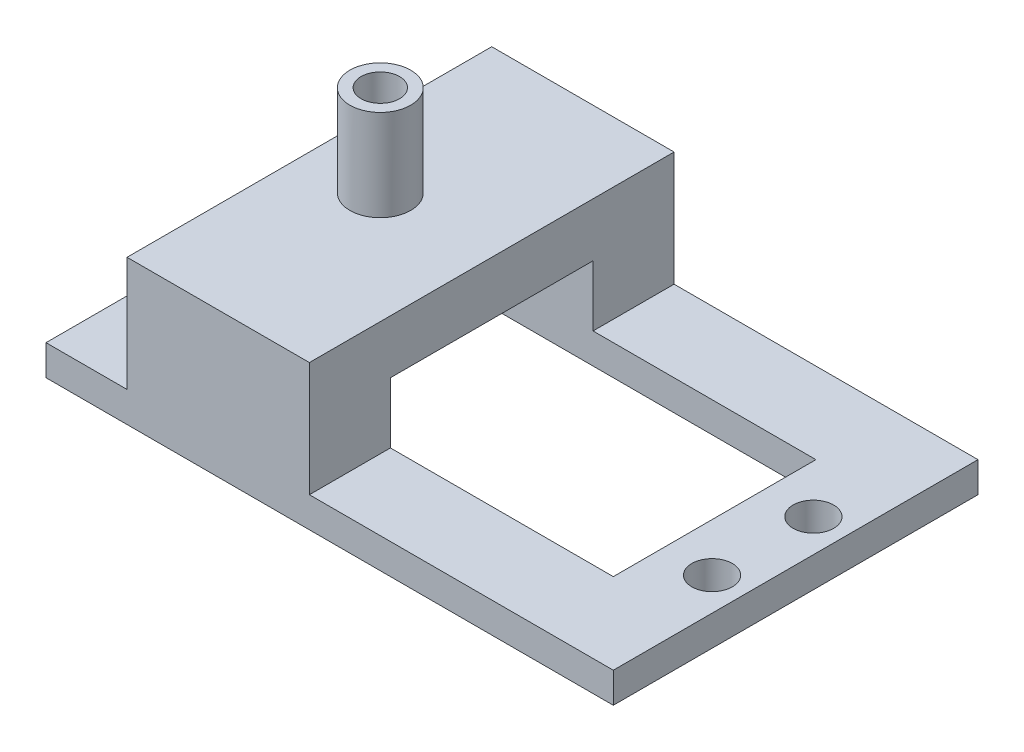
ISO-10303-21;
HEADER;
FILE_DESCRIPTION(('STEP AP214'),'2;1');
FILE_NAME('part.step','',(''),(''),'','','');
FILE_SCHEMA(('AUTOMOTIVE_DESIGN { 1 0 10303 214 1 1 1 1 }'));
ENDSEC;
DATA;
#1=APPLICATION_CONTEXT('core data for automotive mechanical design processes');
#2=APPLICATION_PROTOCOL_DEFINITION('international standard','automotive_design',2000,#1);
#3=PRODUCT_CONTEXT('',#1,'mechanical');
#4=PRODUCT('Part','Part','',(#3));
#5=PRODUCT_RELATED_PRODUCT_CATEGORY('part','',(#4));
#6=PRODUCT_DEFINITION_FORMATION('','',#4);
#7=PRODUCT_DEFINITION_CONTEXT('part definition',#1,'design');
#8=PRODUCT_DEFINITION('design','',#6,#7);
#9=PRODUCT_DEFINITION_SHAPE('','',#8);
#10=(LENGTH_UNIT() NAMED_UNIT(*) SI_UNIT(.MILLI.,.METRE.));
#11=(NAMED_UNIT(*) PLANE_ANGLE_UNIT() SI_UNIT($,.RADIAN.));
#12=(NAMED_UNIT(*) SI_UNIT($,.STERADIAN.) SOLID_ANGLE_UNIT());
#13=UNCERTAINTY_MEASURE_WITH_UNIT(LENGTH_MEASURE(1.E-05),#10,'distance_accuracy_value','');
#14=(GEOMETRIC_REPRESENTATION_CONTEXT(3) GLOBAL_UNCERTAINTY_ASSIGNED_CONTEXT((#13)) GLOBAL_UNIT_ASSIGNED_CONTEXT((#10,
#11,#12)) REPRESENTATION_CONTEXT('',''));
#15=CARTESIAN_POINT('',(0.,0.,0.));
#16=DIRECTION('',(0.,0.,1.));
#17=DIRECTION('',(1.,0.,0.));
#18=AXIS2_PLACEMENT_3D('',#15,#16,#17);
#19=CARTESIAN_POINT('',(-14.0978187475176,11.3,5.43830762610883));
#20=DIRECTION('',(0.,-1.,0.));
#21=DIRECTION('',(0.,0.,-1.));
#22=AXIS2_PLACEMENT_3D('',#19,#20,#21);
#23=CYLINDRICAL_SURFACE('',#22,1.9);
#24=CARTESIAN_POINT('',(-14.0978187475176,20.3,5.43830762610883));
#25=DIRECTION('',(0.,1.,0.));
#26=DIRECTION('',(0.,0.,1.));
#27=AXIS2_PLACEMENT_3D('',#24,#25,#26);
#28=CIRCLE('',#27,1.9);
#29=CARTESIAN_POINT('',(-14.0978187475176,20.3,7.33830762610883));
#30=VERTEX_POINT('',#29);
#31=EDGE_CURVE('E243',#30,#30,#28,.T.);
#32=ORIENTED_EDGE('',*,*,#31,.T.);
#33=EDGE_LOOP('',(#32));
#34=FACE_BOUND('',#33,.T.);
#35=CARTESIAN_POINT('',(-14.0978187475176,9.,5.43830762610883));
#36=DIRECTION('',(0.,-1.,0.));
#37=DIRECTION('',(0.,0.,-1.));
#38=AXIS2_PLACEMENT_3D('',#35,#36,#37);
#39=CIRCLE('',#38,1.9);
#40=CARTESIAN_POINT('',(-14.0978187475176,9.,3.53830762610883));
#41=VERTEX_POINT('',#40);
#42=EDGE_CURVE('E45',#41,#41,#39,.T.);
#43=ORIENTED_EDGE('',*,*,#42,.T.);
#44=EDGE_LOOP('',(#43));
#45=FACE_BOUND('',#44,.T.);
#46=ADVANCED_FACE('F41',(#34,#45),#23,.F.);
#47=CARTESIAN_POINT('',(0.,11.3,0.));
#48=DIRECTION('',(0.,-1.,0.));
#49=DIRECTION('',(0.,0.,-1.));
#50=AXIS2_PLACEMENT_3D('',#47,#48,#49);
#51=PLANE('',#50);
#52=DIRECTION('',(0.,0.,1.));
#53=VECTOR('',#52,1.);
#54=CARTESIAN_POINT('',(-21.0978187475176,11.3,23.4383076261088));
#55=LINE('',#54,#53);
#56=CARTESIAN_POINT('',(-21.0978187475176,11.3,-12.5616923738912));
#57=VERTEX_POINT('',#56);
#58=CARTESIAN_POINT('',(-21.0978187475176,11.3,23.4383076261088));
#59=VERTEX_POINT('',#58);
#60=EDGE_CURVE('E250',#57,#59,#55,.T.);
#61=ORIENTED_EDGE('',*,*,#60,.T.);
#62=DIRECTION('',(1.,0.,0.));
#63=VECTOR('',#62,1.);
#64=CARTESIAN_POINT('',(-21.0978187475176,11.3,23.4383076261088));
#65=LINE('',#64,#63);
#66=CARTESIAN_POINT('',(-3.09781874751758,11.3,23.4383076261088));
#67=VERTEX_POINT('',#66);
#68=EDGE_CURVE('E253',#59,#67,#65,.T.);
#69=ORIENTED_EDGE('',*,*,#68,.T.);
#70=DIRECTION('',(0.,0.,-1.));
#71=VECTOR('',#70,1.);
#72=CARTESIAN_POINT('',(-3.09781874751758,11.3,23.4383076261088));
#73=LINE('',#72,#71);
#74=CARTESIAN_POINT('',(-3.09781874751758,11.3,-12.5616923738912));
#75=VERTEX_POINT('',#74);
#76=EDGE_CURVE('E257',#67,#75,#73,.T.);
#77=ORIENTED_EDGE('',*,*,#76,.T.);
#78=DIRECTION('',(-1.,0.,0.));
#79=VECTOR('',#78,1.);
#80=CARTESIAN_POINT('',(-21.0978187475176,11.3,-12.5616923738912));
#81=LINE('',#80,#79);
#82=EDGE_CURVE('E260',#75,#57,#81,.T.);
#83=ORIENTED_EDGE('',*,*,#82,.T.);
#84=EDGE_LOOP('',(#61,#69,#77,#83));
#85=FACE_BOUND('',#84,.T.);
#86=CARTESIAN_POINT('',(-14.0978187475176,11.3,5.43830762610883));
#87=DIRECTION('',(0.,-1.,0.));
#88=DIRECTION('',(0.,0.,-1.));
#89=AXIS2_PLACEMENT_3D('',#86,#87,#88);
#90=CIRCLE('',#89,3.);
#91=CARTESIAN_POINT('',(-14.0978187475176,11.3,2.43830762610883));
#92=VERTEX_POINT('',#91);
#93=EDGE_CURVE('E11',#92,#92,#90,.F.);
#94=ORIENTED_EDGE('',*,*,#93,.F.);
#95=EDGE_LOOP('',(#94));
#96=FACE_BOUND('',#95,.T.);
#97=ADVANCED_FACE('F423',(#85,#96),#51,.F.);
#98=CARTESIAN_POINT('',(0.,0.,0.));
#99=DIRECTION('',(0.,1.,0.));
#100=DIRECTION('',(0.,0.,1.));
#101=AXIS2_PLACEMENT_3D('',#98,#99,#100);
#102=PLANE('',#101);
#103=CARTESIAN_POINT('',(-25.8478187475176,0.,0.438307626108829));
#104=DIRECTION('',(0.,1.,0.));
#105=DIRECTION('',(0.,0.,1.));
#106=AXIS2_PLACEMENT_3D('',#103,#104,#105);
#107=CIRCLE('',#106,2.);
#108=CARTESIAN_POINT('',(-25.8478187475176,0.,2.43830762610883));
#109=VERTEX_POINT('',#108);
#110=EDGE_CURVE('E631',#109,#109,#107,.T.);
#111=ORIENTED_EDGE('',*,*,#110,.F.);
#112=EDGE_LOOP('',(#111));
#113=FACE_BOUND('',#112,.T.);
#114=CARTESIAN_POINT('',(-25.8478187475176,0.,10.4383076261088));
#115=DIRECTION('',(0.,1.,0.));
#116=DIRECTION('',(0.,0.,1.));
#117=AXIS2_PLACEMENT_3D('',#114,#115,#116);
#118=CIRCLE('',#117,2.);
#119=CARTESIAN_POINT('',(-25.8478187475176,0.,12.4383076261088));
#120=VERTEX_POINT('',#119);
#121=EDGE_CURVE('E641',#120,#120,#118,.T.);
#122=ORIENTED_EDGE('',*,*,#121,.F.);
#123=EDGE_LOOP('',(#122));
#124=FACE_BOUND('',#123,.T.);
#125=DIRECTION('',(0.,0.,1.));
#126=VECTOR('',#125,1.);
#127=CARTESIAN_POINT('',(-21.0978187475176,0.,-4.56169237389117));
#128=LINE('',#127,#126);
#129=CARTESIAN_POINT('',(-21.0978187475176,0.,-12.5616923738912));
#130=VERTEX_POINT('',#129);
#131=CARTESIAN_POINT('',(-21.0978187475176,0.,-4.56169237389117));
#132=VERTEX_POINT('',#131);
#133=EDGE_CURVE('E272',#130,#132,#128,.T.);
#134=ORIENTED_EDGE('',*,*,#133,.F.);
#135=DIRECTION('',(1.,0.,0.));
#136=VECTOR('',#135,1.);
#137=CARTESIAN_POINT('',(0.,0.,-12.5616923738912));
#138=LINE('',#137,#136);
#139=CARTESIAN_POINT('',(-29.0978187475176,0.,-12.5616923738912));
#140=VERTEX_POINT('',#139);
#141=EDGE_CURVE('E336',#140,#130,#138,.T.);
#142=ORIENTED_EDGE('',*,*,#141,.F.);
#143=DIRECTION('',(0.,0.,-1.));
#144=VECTOR('',#143,1.);
#145=CARTESIAN_POINT('',(-29.0978187475176,0.,0.));
#146=LINE('',#145,#144);
#147=CARTESIAN_POINT('',(-29.0978187475176,0.,23.4383076261088));
#148=VERTEX_POINT('',#147);
#149=EDGE_CURVE('E339',#148,#140,#146,.T.);
#150=ORIENTED_EDGE('',*,*,#149,.F.);
#151=DIRECTION('',(1.,0.,0.));
#152=VECTOR('',#151,1.);
#153=CARTESIAN_POINT('',(-29.0978187475176,0.,23.4383076261088));
#154=LINE('',#153,#152);
#155=CARTESIAN_POINT('',(-21.0978187475176,0.,23.4383076261088));
#156=VERTEX_POINT('',#155);
#157=EDGE_CURVE('E366',#148,#156,#154,.T.);
#158=ORIENTED_EDGE('',*,*,#157,.T.);
#159=DIRECTION('',(0.,0.,1.));
#160=VECTOR('',#159,1.);
#161=CARTESIAN_POINT('',(-21.0978187475176,0.,15.4383076261088));
#162=LINE('',#161,#160);
#163=CARTESIAN_POINT('',(-21.0978187475176,0.,15.4383076261088));
#164=VERTEX_POINT('',#163);
#165=EDGE_CURVE('E275',#164,#156,#162,.T.);
#166=ORIENTED_EDGE('',*,*,#165,.F.);
#167=DIRECTION('',(0.,0.,1.));
#168=VECTOR('',#167,1.);
#169=CARTESIAN_POINT('',(-21.0978187475176,0.,0.));
#170=LINE('',#169,#168);
#171=EDGE_CURVE('E312',#132,#164,#170,.T.);
#172=ORIENTED_EDGE('',*,*,#171,.F.);
#173=EDGE_LOOP('',(#134,#142,#150,#158,#166,#172));
#174=FACE_BOUND('',#173,.T.);
#175=ADVANCED_FACE('F413',(#113,#124,#174),#102,.T.);
#176=CARTESIAN_POINT('',(-21.0978187475176,-3.,0.));
#177=DIRECTION('',(-1.,0.,0.));
#178=DIRECTION('',(0.,0.,1.));
#179=AXIS2_PLACEMENT_3D('',#176,#177,#178);
#180=PLANE('',#179);
#181=ORIENTED_EDGE('',*,*,#171,.T.);
#182=DIRECTION('',(0.,1.,0.));
#183=VECTOR('',#182,1.);
#184=CARTESIAN_POINT('',(-21.0978187475176,-3.,15.4383076261088));
#185=LINE('',#184,#183);
#186=CARTESIAN_POINT('',(-21.0978187475176,-3.,15.4383076261088));
#187=VERTEX_POINT('',#186);
#188=EDGE_CURVE('E344',#187,#164,#185,.T.);
#189=ORIENTED_EDGE('',*,*,#188,.F.);
#190=DIRECTION('',(0.,0.,1.));
#191=VECTOR('',#190,1.);
#192=CARTESIAN_POINT('',(-21.0978187475176,-3.,0.));
#193=LINE('',#192,#191);
#194=CARTESIAN_POINT('',(-21.0978187475176,-3.,-4.56169237389117));
#195=VERTEX_POINT('',#194);
#196=EDGE_CURVE('E322',#195,#187,#193,.T.);
#197=ORIENTED_EDGE('',*,*,#196,.F.);
#198=DIRECTION('',(0.,1.,0.));
#199=VECTOR('',#198,1.);
#200=CARTESIAN_POINT('',(-21.0978187475176,-3.,-4.56169237389117));
#201=LINE('',#200,#199);
#202=EDGE_CURVE('E50',#195,#132,#201,.T.);
#203=ORIENTED_EDGE('',*,*,#202,.T.);
#204=EDGE_LOOP('',(#181,#189,#197,#203));
#205=FACE_BOUND('',#204,.T.);
#206=ADVANCED_FACE('F406',(#205),#180,.F.);
#207=CARTESIAN_POINT('',(-29.0978187475176,-3.,0.));
#208=DIRECTION('',(1.,0.,0.));
#209=DIRECTION('',(0.,0.,-1.));
#210=AXIS2_PLACEMENT_3D('',#207,#208,#209);
#211=PLANE('',#210);
#212=ORIENTED_EDGE('',*,*,#149,.T.);
#213=DIRECTION('',(0.,1.,0.));
#214=VECTOR('',#213,1.);
#215=CARTESIAN_POINT('',(-29.0978187475176,-3.,-12.5616923738912));
#216=LINE('',#215,#214);
#217=CARTESIAN_POINT('',(-29.0978187475176,-3.,-12.5616923738912));
#218=VERTEX_POINT('',#217);
#219=EDGE_CURVE('E347',#218,#140,#216,.T.);
#220=ORIENTED_EDGE('',*,*,#219,.F.);
#221=DIRECTION('',(0.,0.,-1.));
#222=VECTOR('',#221,1.);
#223=CARTESIAN_POINT('',(-29.0978187475176,-3.,0.));
#224=LINE('',#223,#222);
#225=CARTESIAN_POINT('',(-29.0978187475176,-3.,23.4383076261088));
#226=VERTEX_POINT('',#225);
#227=EDGE_CURVE('E320',#226,#218,#224,.T.);
#228=ORIENTED_EDGE('',*,*,#227,.F.);
#229=DIRECTION('',(0.,1.,0.));
#230=VECTOR('',#229,1.);
#231=CARTESIAN_POINT('',(-29.0978187475176,-3.,23.4383076261088));
#232=LINE('',#231,#230);
#233=EDGE_CURVE('E329',#226,#148,#232,.T.);
#234=ORIENTED_EDGE('',*,*,#233,.T.);
#235=EDGE_LOOP('',(#212,#220,#228,#234));
#236=FACE_BOUND('',#235,.T.);
#237=ADVANCED_FACE('F420',(#236),#211,.F.);
#238=CARTESIAN_POINT('',(0.,-3.,-12.5616923738912));
#239=DIRECTION('',(0.,0.,1.));
#240=DIRECTION('',(1.,0.,0.));
#241=AXIS2_PLACEMENT_3D('',#238,#239,#240);
#242=PLANE('',#241);
#243=ORIENTED_EDGE('',*,*,#141,.T.);
#244=DIRECTION('',(0.,-1.,0.));
#245=VECTOR('',#244,1.);
#246=CARTESIAN_POINT('',(-21.0978187475176,6.,-12.5616923738912));
#247=LINE('',#246,#245);
#248=EDGE_CURVE('E271',#57,#130,#247,.T.);
#249=ORIENTED_EDGE('',*,*,#248,.F.);
#250=ORIENTED_EDGE('',*,*,#82,.F.);
#251=DIRECTION('',(0.,-1.,0.));
#252=VECTOR('',#251,1.);
#253=CARTESIAN_POINT('',(-3.09781874751758,6.,-12.5616923738912));
#254=LINE('',#253,#252);
#255=CARTESIAN_POINT('',(-3.09781874751758,0.,-12.5616923738912));
#256=VERTEX_POINT('',#255);
#257=EDGE_CURVE('E279',#75,#256,#254,.T.);
#258=ORIENTED_EDGE('',*,*,#257,.T.);
#259=CARTESIAN_POINT('',(26.9021812524824,0.,-12.5616923738912));
#260=VERTEX_POINT('',#259);
#261=EDGE_CURVE('E335',#256,#260,#138,.T.);
#262=ORIENTED_EDGE('',*,*,#261,.T.);
#263=DIRECTION('',(0.,1.,0.));
#264=VECTOR('',#263,1.);
#265=CARTESIAN_POINT('',(26.9021812524824,-3.,-12.5616923738912));
#266=LINE('',#265,#264);
#267=CARTESIAN_POINT('',(26.9021812524824,-3.,-12.5616923738912));
#268=VERTEX_POINT('',#267);
#269=EDGE_CURVE('E350',#268,#260,#266,.T.);
#270=ORIENTED_EDGE('',*,*,#269,.F.);
#271=DIRECTION('',(1.,0.,0.));
#272=VECTOR('',#271,1.);
#273=CARTESIAN_POINT('',(0.,-3.,-12.5616923738912));
#274=LINE('',#273,#272);
#275=EDGE_CURVE('E318',#218,#268,#274,.T.);
#276=ORIENTED_EDGE('',*,*,#275,.F.);
#277=ORIENTED_EDGE('',*,*,#219,.T.);
#278=EDGE_LOOP('',(#243,#249,#250,#258,#262,#270,#276,#277));
#279=FACE_BOUND('',#278,.T.);
#280=ADVANCED_FACE('F415',(#279),#242,.F.);
#281=CARTESIAN_POINT('',(26.9021812524824,-3.,0.));
#282=DIRECTION('',(1.,0.,0.));
#283=DIRECTION('',(0.,0.,-1.));
#284=AXIS2_PLACEMENT_3D('',#281,#282,#283);
#285=PLANE('',#284);
#286=DIRECTION('',(0.,0.,-1.));
#287=VECTOR('',#286,1.);
#288=CARTESIAN_POINT('',(26.9021812524824,0.,0.));
#289=LINE('',#288,#287);
#290=CARTESIAN_POINT('',(26.9021812524824,0.,23.4383076261088));
#291=VERTEX_POINT('',#290);
#292=EDGE_CURVE('E332',#291,#260,#289,.T.);
#293=ORIENTED_EDGE('',*,*,#292,.F.);
#294=DIRECTION('',(0.,1.,0.));
#295=VECTOR('',#294,1.);
#296=CARTESIAN_POINT('',(26.9021812524824,-3.,23.4383076261088));
#297=LINE('',#296,#295);
#298=CARTESIAN_POINT('',(26.9021812524824,-3.,23.4383076261088));
#299=VERTEX_POINT('',#298);
#300=EDGE_CURVE('E365',#299,#291,#297,.T.);
#301=ORIENTED_EDGE('',*,*,#300,.F.);
#302=DIRECTION('',(0.,0.,-1.));
#303=VECTOR('',#302,1.);
#304=CARTESIAN_POINT('',(26.9021812524824,-3.,0.));
#305=LINE('',#304,#303);
#306=EDGE_CURVE('E315',#299,#268,#305,.T.);
#307=ORIENTED_EDGE('',*,*,#306,.T.);
#308=ORIENTED_EDGE('',*,*,#269,.T.);
#309=EDGE_LOOP('',(#293,#301,#307,#308));
#310=FACE_BOUND('',#309,.T.);
#311=ADVANCED_FACE('F380',(#310),#285,.T.);
#312=CARTESIAN_POINT('',(18.9021812524824,-3.,0.));
#313=DIRECTION('',(-1.,0.,0.));
#314=DIRECTION('',(0.,0.,1.));
#315=AXIS2_PLACEMENT_3D('',#312,#313,#314);
#316=PLANE('',#315);
#317=DIRECTION('',(0.,0.,1.));
#318=VECTOR('',#317,1.);
#319=CARTESIAN_POINT('',(18.9021812524824,0.,0.));
#320=LINE('',#319,#318);
#321=CARTESIAN_POINT('',(18.9021812524824,0.,-4.56169237389117));
#322=VERTEX_POINT('',#321);
#323=CARTESIAN_POINT('',(18.9021812524824,0.,15.4383076261088));
#324=VERTEX_POINT('',#323);
#325=EDGE_CURVE('E328',#322,#324,#320,.T.);
#326=ORIENTED_EDGE('',*,*,#325,.F.);
#327=DIRECTION('',(0.,1.,0.));
#328=VECTOR('',#327,1.);
#329=CARTESIAN_POINT('',(18.9021812524824,-3.,-4.56169237389117));
#330=LINE('',#329,#328);
#331=CARTESIAN_POINT('',(18.9021812524824,-3.,-4.56169237389117));
#332=VERTEX_POINT('',#331);
#333=EDGE_CURVE('E325',#332,#322,#330,.T.);
#334=ORIENTED_EDGE('',*,*,#333,.F.);
#335=DIRECTION('',(0.,0.,1.));
#336=VECTOR('',#335,1.);
#337=CARTESIAN_POINT('',(18.9021812524824,-3.,0.));
#338=LINE('',#337,#336);
#339=CARTESIAN_POINT('',(18.9021812524824,-3.,15.4383076261088));
#340=VERTEX_POINT('',#339);
#341=EDGE_CURVE('E311',#332,#340,#338,.T.);
#342=ORIENTED_EDGE('',*,*,#341,.T.);
#343=DIRECTION('',(0.,1.,0.));
#344=VECTOR('',#343,1.);
#345=CARTESIAN_POINT('',(18.9021812524824,-3.,15.4383076261088));
#346=LINE('',#345,#344);
#347=EDGE_CURVE('E353',#340,#324,#346,.T.);
#348=ORIENTED_EDGE('',*,*,#347,.T.);
#349=EDGE_LOOP('',(#326,#334,#342,#348));
#350=FACE_BOUND('',#349,.T.);
#351=ADVANCED_FACE('F399',(#350),#316,.T.);
#352=CARTESIAN_POINT('',(0.,-3.,-4.56169237389117));
#353=DIRECTION('',(0.,0.,1.));
#354=DIRECTION('',(1.,0.,0.));
#355=AXIS2_PLACEMENT_3D('',#352,#353,#354);
#356=PLANE('',#355);
#357=DIRECTION('',(1.,0.,0.));
#358=VECTOR('',#357,1.);
#359=CARTESIAN_POINT('',(0.,0.,-4.56169237389117));
#360=LINE('',#359,#358);
#361=CARTESIAN_POINT('',(-3.09781874751758,0.,-4.56169237389117));
#362=VERTEX_POINT('',#361);
#363=EDGE_CURVE('E326',#362,#322,#360,.T.);
#364=ORIENTED_EDGE('',*,*,#363,.F.);
#365=DIRECTION('',(0.,-1.,0.));
#366=VECTOR('',#365,1.);
#367=CARTESIAN_POINT('',(-3.09781874751758,6.,-4.56169237389117));
#368=LINE('',#367,#366);
#369=CARTESIAN_POINT('',(-3.09781874751758,6.,-4.56169237389117));
#370=VERTEX_POINT('',#369);
#371=EDGE_CURVE('E282',#370,#362,#368,.T.);
#372=ORIENTED_EDGE('',*,*,#371,.F.);
#373=DIRECTION('',(1.,0.,0.));
#374=VECTOR('',#373,1.);
#375=CARTESIAN_POINT('',(-21.0978187475176,6.,-4.56169237389117));
#376=LINE('',#375,#374);
#377=CARTESIAN_POINT('',(-21.0978187475176,6.,-4.56169237389117));
#378=VERTEX_POINT('',#377);
#379=EDGE_CURVE('E268',#378,#370,#376,.T.);
#380=ORIENTED_EDGE('',*,*,#379,.F.);
#381=DIRECTION('',(0.,-1.,0.));
#382=VECTOR('',#381,1.);
#383=CARTESIAN_POINT('',(-21.0978187475176,6.,-4.56169237389117));
#384=LINE('',#383,#382);
#385=EDGE_CURVE('E285',#378,#132,#384,.T.);
#386=ORIENTED_EDGE('',*,*,#385,.T.);
#387=ORIENTED_EDGE('',*,*,#202,.F.);
#388=DIRECTION('',(1.,0.,0.));
#389=VECTOR('',#388,1.);
#390=CARTESIAN_POINT('',(0.,-3.,-4.56169237389117));
#391=LINE('',#390,#389);
#392=EDGE_CURVE('E308',#195,#332,#391,.T.);
#393=ORIENTED_EDGE('',*,*,#392,.T.);
#394=ORIENTED_EDGE('',*,*,#333,.T.);
#395=EDGE_LOOP('',(#364,#372,#380,#386,#387,#393,#394));
#396=FACE_BOUND('',#395,.T.);
#397=ADVANCED_FACE('F395',(#396),#356,.T.);
#398=CARTESIAN_POINT('',(23.6521812524824,0.,10.4383076261088));
#399=DIRECTION('',(0.,1.,0.));
#400=DIRECTION('',(0.,0.,1.));
#401=AXIS2_PLACEMENT_3D('',#398,#399,#400);
#402=CIRCLE('',#401,2.);
#403=CARTESIAN_POINT('',(23.6521812524824,0.,12.4383076261088));
#404=VERTEX_POINT('',#403);
#405=EDGE_CURVE('E628',#404,#404,#402,.T.);
#406=ORIENTED_EDGE('',*,*,#405,.F.);
#407=EDGE_LOOP('',(#406));
#408=FACE_BOUND('',#407,.T.);
#409=CARTESIAN_POINT('',(23.6521812524824,0.,0.438307626108829));
#410=DIRECTION('',(0.,1.,0.));
#411=DIRECTION('',(0.,0.,1.));
#412=AXIS2_PLACEMENT_3D('',#409,#410,#411);
#413=CIRCLE('',#412,2.);
#414=CARTESIAN_POINT('',(23.6521812524824,0.,2.43830762610883));
#415=VERTEX_POINT('',#414);
#416=EDGE_CURVE('E212',#415,#415,#413,.T.);
#417=ORIENTED_EDGE('',*,*,#416,.F.);
#418=EDGE_LOOP('',(#417));
#419=FACE_BOUND('',#418,.T.);
#420=DIRECTION('',(0.,0.,-1.));
#421=VECTOR('',#420,1.);
#422=CARTESIAN_POINT('',(-3.09781874751758,0.,-4.56169237389117));
#423=LINE('',#422,#421);
#424=EDGE_CURVE('E65',#362,#256,#423,.T.);
#425=ORIENTED_EDGE('',*,*,#424,.F.);
#426=ORIENTED_EDGE('',*,*,#363,.T.);
#427=ORIENTED_EDGE('',*,*,#325,.T.);
#428=DIRECTION('',(1.,0.,0.));
#429=VECTOR('',#428,1.);
#430=CARTESIAN_POINT('',(-29.0978187475176,0.,15.4383076261088));
#431=LINE('',#430,#429);
#432=CARTESIAN_POINT('',(-3.09781874751757,0.,15.4383076261088));
#433=VERTEX_POINT('',#432);
#434=EDGE_CURVE('E362',#433,#324,#431,.T.);
#435=ORIENTED_EDGE('',*,*,#434,.F.);
#436=DIRECTION('',(0.,0.,-1.));
#437=VECTOR('',#436,1.);
#438=CARTESIAN_POINT('',(-3.09781874751757,0.,15.4383076261088));
#439=LINE('',#438,#437);
#440=CARTESIAN_POINT('',(-3.09781874751757,0.,23.4383076261088));
#441=VERTEX_POINT('',#440);
#442=EDGE_CURVE('E301',#441,#433,#439,.T.);
#443=ORIENTED_EDGE('',*,*,#442,.F.);
#444=EDGE_CURVE('E288',#441,#291,#154,.T.);
#445=ORIENTED_EDGE('',*,*,#444,.T.);
#446=ORIENTED_EDGE('',*,*,#292,.T.);
#447=ORIENTED_EDGE('',*,*,#261,.F.);
#448=EDGE_LOOP('',(#425,#426,#427,#435,#443,#445,#446,#447));
#449=FACE_BOUND('',#448,.T.);
#450=ADVANCED_FACE('F382',(#408,#419,#449),#102,.T.);
#451=CARTESIAN_POINT('',(0.,-3.,0.));
#452=DIRECTION('',(0.,1.,0.));
#453=DIRECTION('',(0.,0.,1.));
#454=AXIS2_PLACEMENT_3D('',#451,#452,#453);
#455=PLANE('',#454);
#456=CARTESIAN_POINT('',(23.6521812524824,-3.,10.4383076261088));
#457=DIRECTION('',(0.,1.,0.));
#458=DIRECTION('',(0.,0.,1.));
#459=AXIS2_PLACEMENT_3D('',#456,#457,#458);
#460=CIRCLE('',#459,2.);
#461=CARTESIAN_POINT('',(23.6521812524824,-3.,12.4383076261088));
#462=VERTEX_POINT('',#461);
#463=EDGE_CURVE('E625',#462,#462,#460,.T.);
#464=ORIENTED_EDGE('',*,*,#463,.T.);
#465=EDGE_LOOP('',(#464));
#466=FACE_BOUND('',#465,.T.);
#467=CARTESIAN_POINT('',(-25.8478187475176,-3.,0.438307626108829));
#468=DIRECTION('',(0.,1.,0.));
#469=DIRECTION('',(0.,0.,1.));
#470=AXIS2_PLACEMENT_3D('',#467,#468,#469);
#471=CIRCLE('',#470,2.);
#472=CARTESIAN_POINT('',(-25.8478187475176,-3.,2.43830762610883));
#473=VERTEX_POINT('',#472);
#474=EDGE_CURVE('E639',#473,#473,#471,.T.);
#475=ORIENTED_EDGE('',*,*,#474,.T.);
#476=EDGE_LOOP('',(#475));
#477=FACE_BOUND('',#476,.T.);
#478=CARTESIAN_POINT('',(-25.8478187475176,-3.,10.4383076261088));
#479=DIRECTION('',(0.,1.,0.));
#480=DIRECTION('',(0.,0.,1.));
#481=AXIS2_PLACEMENT_3D('',#478,#479,#480);
#482=CIRCLE('',#481,2.);
#483=CARTESIAN_POINT('',(-25.8478187475176,-3.,12.4383076261088));
#484=VERTEX_POINT('',#483);
#485=EDGE_CURVE('E634',#484,#484,#482,.T.);
#486=ORIENTED_EDGE('',*,*,#485,.T.);
#487=EDGE_LOOP('',(#486));
#488=FACE_BOUND('',#487,.T.);
#489=CARTESIAN_POINT('',(23.6521812524824,-3.,0.438307626108829));
#490=DIRECTION('',(0.,1.,0.));
#491=DIRECTION('',(0.,0.,1.));
#492=AXIS2_PLACEMENT_3D('',#489,#490,#491);
#493=CIRCLE('',#492,2.);
#494=CARTESIAN_POINT('',(23.6521812524824,-3.,2.43830762610883));
#495=VERTEX_POINT('',#494);
#496=EDGE_CURVE('E224',#495,#495,#493,.T.);
#497=ORIENTED_EDGE('',*,*,#496,.T.);
#498=EDGE_LOOP('',(#497));
#499=FACE_BOUND('',#498,.T.);
#500=ORIENTED_EDGE('',*,*,#306,.F.);
#501=DIRECTION('',(1.,0.,0.));
#502=VECTOR('',#501,1.);
#503=CARTESIAN_POINT('',(-29.0978187475176,-3.,23.4383076261088));
#504=LINE('',#503,#502);
#505=EDGE_CURVE('E358',#226,#299,#504,.T.);
#506=ORIENTED_EDGE('',*,*,#505,.F.);
#507=ORIENTED_EDGE('',*,*,#227,.T.);
#508=ORIENTED_EDGE('',*,*,#275,.T.);
#509=EDGE_LOOP('',(#500,#506,#507,#508));
#510=FACE_BOUND('',#509,.T.);
#511=ORIENTED_EDGE('',*,*,#392,.F.);
#512=ORIENTED_EDGE('',*,*,#196,.T.);
#513=DIRECTION('',(1.,0.,0.));
#514=VECTOR('',#513,1.);
#515=CARTESIAN_POINT('',(-29.0978187475176,-3.,15.4383076261088));
#516=LINE('',#515,#514);
#517=EDGE_CURVE('E361',#187,#340,#516,.T.);
#518=ORIENTED_EDGE('',*,*,#517,.T.);
#519=ORIENTED_EDGE('',*,*,#341,.F.);
#520=EDGE_LOOP('',(#511,#512,#518,#519));
#521=FACE_BOUND('',#520,.T.);
#522=ADVANCED_FACE('F403',(#466,#477,#488,#499,#510,#521),#455,.F.);
#523=CARTESIAN_POINT('',(-29.0978187475176,-3.,15.4383076261088));
#524=DIRECTION('',(0.,0.,1.));
#525=DIRECTION('',(1.,0.,0.));
#526=AXIS2_PLACEMENT_3D('',#523,#524,#525);
#527=PLANE('',#526);
#528=ORIENTED_EDGE('',*,*,#517,.F.);
#529=ORIENTED_EDGE('',*,*,#188,.T.);
#530=DIRECTION('',(0.,-1.,0.));
#531=VECTOR('',#530,1.);
#532=CARTESIAN_POINT('',(-21.0978187475176,6.,15.4383076261088));
#533=LINE('',#532,#531);
#534=CARTESIAN_POINT('',(-21.0978187475176,6.,15.4383076261088));
#535=VERTEX_POINT('',#534);
#536=EDGE_CURVE('E297',#535,#164,#533,.T.);
#537=ORIENTED_EDGE('',*,*,#536,.F.);
#538=DIRECTION('',(-1.,0.,0.));
#539=VECTOR('',#538,1.);
#540=CARTESIAN_POINT('',(-21.0978187475176,6.,15.4383076261088));
#541=LINE('',#540,#539);
#542=CARTESIAN_POINT('',(-3.09781874751757,6.,15.4383076261088));
#543=VERTEX_POINT('',#542);
#544=EDGE_CURVE('E300',#543,#535,#541,.T.);
#545=ORIENTED_EDGE('',*,*,#544,.F.);
#546=DIRECTION('',(0.,-1.,0.));
#547=VECTOR('',#546,1.);
#548=CARTESIAN_POINT('',(-3.09781874751757,6.,15.4383076261088));
#549=LINE('',#548,#547);
#550=EDGE_CURVE('E294',#543,#433,#549,.T.);
#551=ORIENTED_EDGE('',*,*,#550,.T.);
#552=ORIENTED_EDGE('',*,*,#434,.T.);
#553=ORIENTED_EDGE('',*,*,#347,.F.);
#554=EDGE_LOOP('',(#528,#529,#537,#545,#551,#552,#553));
#555=FACE_BOUND('',#554,.T.);
#556=ADVANCED_FACE('F389',(#555),#527,.F.);
#557=CARTESIAN_POINT('',(-29.0978187475176,-3.,23.4383076261088));
#558=DIRECTION('',(0.,0.,1.));
#559=DIRECTION('',(1.,0.,0.));
#560=AXIS2_PLACEMENT_3D('',#557,#558,#559);
#561=PLANE('',#560);
#562=ORIENTED_EDGE('',*,*,#157,.F.);
#563=ORIENTED_EDGE('',*,*,#233,.F.);
#564=ORIENTED_EDGE('',*,*,#505,.T.);
#565=ORIENTED_EDGE('',*,*,#300,.T.);
#566=ORIENTED_EDGE('',*,*,#444,.F.);
#567=DIRECTION('',(0.,-1.,0.));
#568=VECTOR('',#567,1.);
#569=CARTESIAN_POINT('',(-3.09781874751757,6.,23.4383076261088));
#570=LINE('',#569,#568);
#571=EDGE_CURVE('E291',#67,#441,#570,.T.);
#572=ORIENTED_EDGE('',*,*,#571,.F.);
#573=ORIENTED_EDGE('',*,*,#68,.F.);
#574=DIRECTION('',(0.,-1.,0.));
#575=VECTOR('',#574,1.);
#576=CARTESIAN_POINT('',(-21.0978187475176,6.,23.4383076261088));
#577=LINE('',#576,#575);
#578=EDGE_CURVE('E263',#59,#156,#577,.T.);
#579=ORIENTED_EDGE('',*,*,#578,.T.);
#580=EDGE_LOOP('',(#562,#563,#564,#565,#566,#572,#573,#579));
#581=FACE_BOUND('',#580,.T.);
#582=ADVANCED_FACE('F43',(#581),#561,.T.);
#583=CARTESIAN_POINT('',(-21.0978187475176,6.,-4.56169237389117));
#584=DIRECTION('',(1.,0.,0.));
#585=DIRECTION('',(0.,0.,-1.));
#586=AXIS2_PLACEMENT_3D('',#583,#584,#585);
#587=PLANE('',#586);
#588=ORIENTED_EDGE('',*,*,#133,.T.);
#589=ORIENTED_EDGE('',*,*,#385,.F.);
#590=DIRECTION('',(0.,0.,1.));
#591=VECTOR('',#590,1.);
#592=CARTESIAN_POINT('',(-21.0978187475176,6.,23.4383076261088));
#593=LINE('',#592,#591);
#594=EDGE_CURVE('E249',#378,#535,#593,.T.);
#595=ORIENTED_EDGE('',*,*,#594,.T.);
#596=ORIENTED_EDGE('',*,*,#536,.T.);
#597=ORIENTED_EDGE('',*,*,#165,.T.);
#598=ORIENTED_EDGE('',*,*,#578,.F.);
#599=ORIENTED_EDGE('',*,*,#60,.F.);
#600=ORIENTED_EDGE('',*,*,#248,.T.);
#601=EDGE_LOOP('',(#588,#589,#595,#596,#597,#598,#599,#600));
#602=FACE_BOUND('',#601,.T.);
#603=ADVANCED_FACE('F410',(#602),#587,.F.);
#604=CARTESIAN_POINT('',(-3.09781874751758,6.,-4.56169237389117));
#605=DIRECTION('',(-1.,0.,0.));
#606=DIRECTION('',(0.,0.,1.));
#607=AXIS2_PLACEMENT_3D('',#604,#605,#606);
#608=PLANE('',#607);
#609=ORIENTED_EDGE('',*,*,#424,.T.);
#610=ORIENTED_EDGE('',*,*,#257,.F.);
#611=ORIENTED_EDGE('',*,*,#76,.F.);
#612=ORIENTED_EDGE('',*,*,#571,.T.);
#613=ORIENTED_EDGE('',*,*,#442,.T.);
#614=ORIENTED_EDGE('',*,*,#550,.F.);
#615=DIRECTION('',(0.,0.,-1.));
#616=VECTOR('',#615,1.);
#617=CARTESIAN_POINT('',(-3.09781874751758,6.,23.4383076261088));
#618=LINE('',#617,#616);
#619=EDGE_CURVE('E254',#543,#370,#618,.T.);
#620=ORIENTED_EDGE('',*,*,#619,.T.);
#621=ORIENTED_EDGE('',*,*,#371,.T.);
#622=EDGE_LOOP('',(#609,#610,#611,#612,#613,#614,#620,#621));
#623=FACE_BOUND('',#622,.T.);
#624=ADVANCED_FACE('F384',(#623),#608,.F.);
#625=CARTESIAN_POINT('',(0.,6.,0.));
#626=DIRECTION('',(0.,-1.,0.));
#627=DIRECTION('',(0.,0.,-1.));
#628=AXIS2_PLACEMENT_3D('',#625,#626,#627);
#629=PLANE('',#628);
#630=DIRECTION('',(0.9993630780453,0.,-0.0356852664250198));
#631=VECTOR('',#630,1.);
#632=CARTESIAN_POINT('',(-16.1885763846504,6.,2.09824259834735));
#633=LINE('',#632,#631);
#634=CARTESIAN_POINT('',(-16.1885763846504,6.,2.09824259834735));
#635=VERTEX_POINT('',#634);
#636=CARTESIAN_POINT('',(-12.2506164017505,6.,1.95762588531477));
#637=VERTEX_POINT('',#636);
#638=EDGE_CURVE('E57',#635,#637,#633,.T.);
#639=ORIENTED_EDGE('',*,*,#638,.F.);
#640=DIRECTION('',(0.468777191757766,0.,-0.88331644640395));
#641=VECTOR('',#640,1.);
#642=CARTESIAN_POINT('',(-18.0357787304174,6.,5.5789243391414));
#643=LINE('',#642,#641);
#644=CARTESIAN_POINT('',(-18.0357787304174,6.,5.5789243391414));
#645=VERTEX_POINT('',#644);
#646=EDGE_CURVE('E206',#645,#635,#643,.T.);
#647=ORIENTED_EDGE('',*,*,#646,.F.);
#648=DIRECTION('',(-0.530585886287533,0.,-0.84763117997893));
#649=VECTOR('',#648,1.);
#650=CARTESIAN_POINT('',(-15.9450210932846,6.,8.91898936690289));
#651=LINE('',#650,#649);
#652=CARTESIAN_POINT('',(-15.9450210932846,6.,8.91898936690289));
#653=VERTEX_POINT('',#652);
#654=EDGE_CURVE('E209',#653,#645,#651,.T.);
#655=ORIENTED_EDGE('',*,*,#654,.F.);
#656=DIRECTION('',(-0.9993630780453,0.,0.0356852664250196));
#657=VECTOR('',#656,1.);
#658=CARTESIAN_POINT('',(-12.0070611103848,6.,8.77837265387032));
#659=LINE('',#658,#657);
#660=CARTESIAN_POINT('',(-12.0070611103848,6.,8.77837265387032));
#661=VERTEX_POINT('',#660);
#662=EDGE_CURVE('E229',#661,#653,#659,.T.);
#663=ORIENTED_EDGE('',*,*,#662,.F.);
#664=DIRECTION('',(-0.468777191757766,0.,0.88331644640395));
#665=VECTOR('',#664,1.);
#666=CARTESIAN_POINT('',(-10.1598587646178,6.,5.29769091307625));
#667=LINE('',#666,#665);
#668=CARTESIAN_POINT('',(-10.1598587646178,6.,5.29769091307625));
#669=VERTEX_POINT('',#668);
#670=EDGE_CURVE('E226',#669,#661,#667,.T.);
#671=ORIENTED_EDGE('',*,*,#670,.F.);
#672=DIRECTION('',(0.530585886287533,0.,0.84763117997893));
#673=VECTOR('',#672,1.);
#674=CARTESIAN_POINT('',(-12.2506164017505,6.,1.95762588531477));
#675=LINE('',#674,#673);
#676=EDGE_CURVE('E223',#637,#669,#675,.T.);
#677=ORIENTED_EDGE('',*,*,#676,.F.);
#678=EDGE_LOOP('',(#639,#647,#655,#663,#671,#677));
#679=FACE_BOUND('',#678,.T.);
#680=ORIENTED_EDGE('',*,*,#619,.F.);
#681=ORIENTED_EDGE('',*,*,#544,.T.);
#682=ORIENTED_EDGE('',*,*,#594,.F.);
#683=ORIENTED_EDGE('',*,*,#379,.T.);
#684=EDGE_LOOP('',(#680,#681,#682,#683));
#685=FACE_BOUND('',#684,.T.);
#686=ADVANCED_FACE('F393',(#679,#685),#629,.T.);
#687=CARTESIAN_POINT('',(-14.0978187475176,20.3,5.43830762610883));
#688=DIRECTION('',(0.,1.,0.));
#689=DIRECTION('',(0.,0.,1.));
#690=AXIS2_PLACEMENT_3D('',#687,#688,#689);
#691=PLANE('',#690);
#692=CARTESIAN_POINT('',(-14.0978187475176,20.3,5.43830762610883));
#693=DIRECTION('',(0.,1.,0.));
#694=DIRECTION('',(0.,0.,1.));
#695=AXIS2_PLACEMENT_3D('',#692,#693,#694);
#696=CIRCLE('',#695,3.);
#697=CARTESIAN_POINT('',(-14.0978187475176,20.3,8.43830762610883));
#698=VERTEX_POINT('',#697);
#699=EDGE_CURVE('E246',#698,#698,#696,.T.);
#700=ORIENTED_EDGE('',*,*,#699,.T.);
#701=EDGE_LOOP('',(#700));
#702=FACE_BOUND('',#701,.T.);
#703=ORIENTED_EDGE('',*,*,#31,.F.);
#704=EDGE_LOOP('',(#703));
#705=FACE_BOUND('',#704,.T.);
#706=ADVANCED_FACE('F431',(#702,#705),#691,.T.);
#707=CARTESIAN_POINT('',(-14.0978187475176,20.3,5.43830762610883));
#708=DIRECTION('',(0.,-1.,0.));
#709=DIRECTION('',(0.,0.,-1.));
#710=AXIS2_PLACEMENT_3D('',#707,#708,#709);
#711=CYLINDRICAL_SURFACE('',#710,3.);
#712=ORIENTED_EDGE('',*,*,#699,.F.);
#713=EDGE_LOOP('',(#712));
#714=FACE_BOUND('',#713,.T.);
#715=ORIENTED_EDGE('',*,*,#93,.T.);
#716=EDGE_LOOP('',(#715));
#717=FACE_BOUND('',#716,.T.);
#718=ADVANCED_FACE('F429',(#714,#717),#711,.T.);
#719=CARTESIAN_POINT('',(-16.1885763846504,9.,2.09824259834735));
#720=DIRECTION('',(-0.0356852664250198,0.,-0.999363078045299));
#721=DIRECTION('',(-0.9993630780453,0.,0.0356852664250198));
#722=AXIS2_PLACEMENT_3D('',#719,#720,#721);
#723=PLANE('',#722);
#724=ORIENTED_EDGE('',*,*,#638,.T.);
#725=DIRECTION('',(0.,-1.,0.));
#726=VECTOR('',#725,1.);
#727=CARTESIAN_POINT('',(-12.2506164017505,9.,1.95762588531477));
#728=LINE('',#727,#726);
#729=CARTESIAN_POINT('',(-12.2506164017505,9.,1.95762588531477));
#730=VERTEX_POINT('',#729);
#731=EDGE_CURVE('E183',#730,#637,#728,.T.);
#732=ORIENTED_EDGE('',*,*,#731,.F.);
#733=DIRECTION('',(0.9993630780453,0.,-0.0356852664250198));
#734=VECTOR('',#733,1.);
#735=CARTESIAN_POINT('',(-16.1885763846504,9.,2.09824259834735));
#736=LINE('',#735,#734);
#737=CARTESIAN_POINT('',(-16.1885763846504,9.,2.09824259834735));
#738=VERTEX_POINT('',#737);
#739=EDGE_CURVE('E187',#738,#730,#736,.T.);
#740=ORIENTED_EDGE('',*,*,#739,.F.);
#741=DIRECTION('',(0.,-1.,0.));
#742=VECTOR('',#741,1.);
#743=CARTESIAN_POINT('',(-16.1885763846504,9.,2.09824259834735));
#744=LINE('',#743,#742);
#745=EDGE_CURVE('E234',#738,#635,#744,.T.);
#746=ORIENTED_EDGE('',*,*,#745,.T.);
#747=EDGE_LOOP('',(#724,#732,#740,#746));
#748=FACE_BOUND('',#747,.T.);
#749=ADVANCED_FACE('F185',(#748),#723,.F.);
#750=CARTESIAN_POINT('',(-18.0357787304174,9.,5.5789243391414));
#751=DIRECTION('',(-0.88331644640395,0.,-0.468777191757766));
#752=DIRECTION('',(-0.468777191757766,0.,0.88331644640395));
#753=AXIS2_PLACEMENT_3D('',#750,#751,#752);
#754=PLANE('',#753);
#755=ORIENTED_EDGE('',*,*,#646,.T.);
#756=ORIENTED_EDGE('',*,*,#745,.F.);
#757=DIRECTION('',(0.468777191757766,0.,-0.88331644640395));
#758=VECTOR('',#757,1.);
#759=CARTESIAN_POINT('',(-18.0357787304174,9.,5.5789243391414));
#760=LINE('',#759,#758);
#761=CARTESIAN_POINT('',(-18.0357787304174,9.,5.5789243391414));
#762=VERTEX_POINT('',#761);
#763=EDGE_CURVE('E193',#762,#738,#760,.T.);
#764=ORIENTED_EDGE('',*,*,#763,.F.);
#765=DIRECTION('',(0.,-1.,0.));
#766=VECTOR('',#765,1.);
#767=CARTESIAN_POINT('',(-18.0357787304174,9.,5.5789243391414));
#768=LINE('',#767,#766);
#769=EDGE_CURVE('E236',#762,#645,#768,.T.);
#770=ORIENTED_EDGE('',*,*,#769,.T.);
#771=EDGE_LOOP('',(#755,#756,#764,#770));
#772=FACE_BOUND('',#771,.T.);
#773=ADVANCED_FACE('F439',(#772),#754,.F.);
#774=CARTESIAN_POINT('',(-15.9450210932846,9.,8.91898936690289));
#775=DIRECTION('',(-0.84763117997893,0.,0.530585886287533));
#776=DIRECTION('',(0.530585886287533,0.,0.84763117997893));
#777=AXIS2_PLACEMENT_3D('',#774,#775,#776);
#778=PLANE('',#777);
#779=ORIENTED_EDGE('',*,*,#654,.T.);
#780=ORIENTED_EDGE('',*,*,#769,.F.);
#781=DIRECTION('',(-0.530585886287533,0.,-0.84763117997893));
#782=VECTOR('',#781,1.);
#783=CARTESIAN_POINT('',(-15.9450210932846,9.,8.91898936690289));
#784=LINE('',#783,#782);
#785=CARTESIAN_POINT('',(-15.9450210932846,9.,8.91898936690289));
#786=VERTEX_POINT('',#785);
#787=EDGE_CURVE('E219',#786,#762,#784,.T.);
#788=ORIENTED_EDGE('',*,*,#787,.F.);
#789=DIRECTION('',(0.,-1.,0.));
#790=VECTOR('',#789,1.);
#791=CARTESIAN_POINT('',(-15.9450210932846,9.,8.91898936690289));
#792=LINE('',#791,#790);
#793=EDGE_CURVE('E238',#786,#653,#792,.T.);
#794=ORIENTED_EDGE('',*,*,#793,.T.);
#795=EDGE_LOOP('',(#779,#780,#788,#794));
#796=FACE_BOUND('',#795,.T.);
#797=ADVANCED_FACE('F531',(#796),#778,.F.);
#798=CARTESIAN_POINT('',(-12.0070611103848,9.,8.77837265387032));
#799=DIRECTION('',(0.0356852664250196,0.,0.999363078045299));
#800=DIRECTION('',(0.9993630780453,0.,-0.0356852664250196));
#801=AXIS2_PLACEMENT_3D('',#798,#799,#800);
#802=PLANE('',#801);
#803=ORIENTED_EDGE('',*,*,#662,.T.);
#804=ORIENTED_EDGE('',*,*,#793,.F.);
#805=DIRECTION('',(-0.9993630780453,0.,0.0356852664250196));
#806=VECTOR('',#805,1.);
#807=CARTESIAN_POINT('',(-12.0070611103848,9.,8.77837265387032));
#808=LINE('',#807,#806);
#809=CARTESIAN_POINT('',(-12.0070611103848,9.,8.77837265387032));
#810=VERTEX_POINT('',#809);
#811=EDGE_CURVE('E216',#810,#786,#808,.T.);
#812=ORIENTED_EDGE('',*,*,#811,.F.);
#813=DIRECTION('',(0.,-1.,0.));
#814=VECTOR('',#813,1.);
#815=CARTESIAN_POINT('',(-12.0070611103848,9.,8.77837265387032));
#816=LINE('',#815,#814);
#817=EDGE_CURVE('E240',#810,#661,#816,.T.);
#818=ORIENTED_EDGE('',*,*,#817,.T.);
#819=EDGE_LOOP('',(#803,#804,#812,#818));
#820=FACE_BOUND('',#819,.T.);
#821=ADVANCED_FACE('F541',(#820),#802,.F.);
#822=CARTESIAN_POINT('',(-10.1598587646178,9.,5.29769091307625));
#823=DIRECTION('',(0.88331644640395,0.,0.468777191757766));
#824=DIRECTION('',(0.468777191757766,0.,-0.88331644640395));
#825=AXIS2_PLACEMENT_3D('',#822,#823,#824);
#826=PLANE('',#825);
#827=ORIENTED_EDGE('',*,*,#670,.T.);
#828=ORIENTED_EDGE('',*,*,#817,.F.);
#829=DIRECTION('',(-0.468777191757766,0.,0.88331644640395));
#830=VECTOR('',#829,1.);
#831=CARTESIAN_POINT('',(-10.1598587646178,9.,5.29769091307625));
#832=LINE('',#831,#830);
#833=CARTESIAN_POINT('',(-10.1598587646178,9.,5.29769091307625));
#834=VERTEX_POINT('',#833);
#835=EDGE_CURVE('E201',#834,#810,#832,.T.);
#836=ORIENTED_EDGE('',*,*,#835,.F.);
#837=DIRECTION('',(0.,-1.,0.));
#838=VECTOR('',#837,1.);
#839=CARTESIAN_POINT('',(-10.1598587646178,9.,5.29769091307625));
#840=LINE('',#839,#838);
#841=EDGE_CURVE('E192',#834,#669,#840,.T.);
#842=ORIENTED_EDGE('',*,*,#841,.T.);
#843=EDGE_LOOP('',(#827,#828,#836,#842));
#844=FACE_BOUND('',#843,.T.);
#845=ADVANCED_FACE('F551',(#844),#826,.F.);
#846=CARTESIAN_POINT('',(-12.2506164017505,9.,1.95762588531477));
#847=DIRECTION('',(0.84763117997893,0.,-0.530585886287533));
#848=DIRECTION('',(-0.530585886287533,0.,-0.84763117997893));
#849=AXIS2_PLACEMENT_3D('',#846,#847,#848);
#850=PLANE('',#849);
#851=ORIENTED_EDGE('',*,*,#676,.T.);
#852=ORIENTED_EDGE('',*,*,#841,.F.);
#853=DIRECTION('',(0.530585886287533,0.,0.84763117997893));
#854=VECTOR('',#853,1.);
#855=CARTESIAN_POINT('',(-12.2506164017505,9.,1.95762588531477));
#856=LINE('',#855,#854);
#857=EDGE_CURVE('E196',#730,#834,#856,.T.);
#858=ORIENTED_EDGE('',*,*,#857,.F.);
#859=ORIENTED_EDGE('',*,*,#731,.T.);
#860=EDGE_LOOP('',(#851,#852,#858,#859));
#861=FACE_BOUND('',#860,.T.);
#862=ADVANCED_FACE('F197',(#861),#850,.F.);
#863=CARTESIAN_POINT('',(0.,9.,0.));
#864=DIRECTION('',(0.,-1.,0.));
#865=DIRECTION('',(0.,0.,-1.));
#866=AXIS2_PLACEMENT_3D('',#863,#864,#865);
#867=PLANE('',#866);
#868=ORIENTED_EDGE('',*,*,#42,.F.);
#869=EDGE_LOOP('',(#868));
#870=FACE_BOUND('',#869,.T.);
#871=ORIENTED_EDGE('',*,*,#739,.T.);
#872=ORIENTED_EDGE('',*,*,#857,.T.);
#873=ORIENTED_EDGE('',*,*,#835,.T.);
#874=ORIENTED_EDGE('',*,*,#811,.T.);
#875=ORIENTED_EDGE('',*,*,#787,.T.);
#876=ORIENTED_EDGE('',*,*,#763,.T.);
#877=EDGE_LOOP('',(#871,#872,#873,#874,#875,#876));
#878=FACE_BOUND('',#877,.T.);
#879=ADVANCED_FACE('F203',(#870,#878),#867,.T.);
#880=CARTESIAN_POINT('',(23.6521812524824,-3.,0.438307626108829));
#881=DIRECTION('',(0.,1.,0.));
#882=DIRECTION('',(0.,0.,1.));
#883=AXIS2_PLACEMENT_3D('',#880,#881,#882);
#884=CYLINDRICAL_SURFACE('',#883,2.);
#885=ORIENTED_EDGE('',*,*,#496,.F.);
#886=EDGE_LOOP('',(#885));
#887=FACE_BOUND('',#886,.T.);
#888=ORIENTED_EDGE('',*,*,#416,.T.);
#889=EDGE_LOOP('',(#888));
#890=FACE_BOUND('',#889,.T.);
#891=ADVANCED_FACE('F578',(#887,#890),#884,.F.);
#892=CARTESIAN_POINT('',(-25.8478187475176,-3.,10.4383076261088));
#893=DIRECTION('',(0.,1.,0.));
#894=DIRECTION('',(0.,0.,1.));
#895=AXIS2_PLACEMENT_3D('',#892,#893,#894);
#896=CYLINDRICAL_SURFACE('',#895,2.);
#897=ORIENTED_EDGE('',*,*,#485,.F.);
#898=EDGE_LOOP('',(#897));
#899=FACE_BOUND('',#898,.T.);
#900=ORIENTED_EDGE('',*,*,#121,.T.);
#901=EDGE_LOOP('',(#900));
#902=FACE_BOUND('',#901,.T.);
#903=ADVANCED_FACE('F589',(#899,#902),#896,.F.);
#904=CARTESIAN_POINT('',(-25.8478187475176,-3.,0.438307626108829));
#905=DIRECTION('',(0.,1.,0.));
#906=DIRECTION('',(0.,0.,1.));
#907=AXIS2_PLACEMENT_3D('',#904,#905,#906);
#908=CYLINDRICAL_SURFACE('',#907,2.);
#909=ORIENTED_EDGE('',*,*,#474,.F.);
#910=EDGE_LOOP('',(#909));
#911=FACE_BOUND('',#910,.T.);
#912=ORIENTED_EDGE('',*,*,#110,.T.);
#913=EDGE_LOOP('',(#912));
#914=FACE_BOUND('',#913,.T.);
#915=ADVANCED_FACE('F599',(#911,#914),#908,.F.);
#916=CARTESIAN_POINT('',(23.6521812524824,-3.,10.4383076261088));
#917=DIRECTION('',(0.,1.,0.));
#918=DIRECTION('',(0.,0.,1.));
#919=AXIS2_PLACEMENT_3D('',#916,#917,#918);
#920=CYLINDRICAL_SURFACE('',#919,2.);
#921=ORIENTED_EDGE('',*,*,#463,.F.);
#922=EDGE_LOOP('',(#921));
#923=FACE_BOUND('',#922,.T.);
#924=ORIENTED_EDGE('',*,*,#405,.T.);
#925=EDGE_LOOP('',(#924));
#926=FACE_BOUND('',#925,.T.);
#927=ADVANCED_FACE('F609',(#923,#926),#920,.F.);
#928=CLOSED_SHELL('',(#46,#97,#175,#206,#237,#280,#311,#351,#397,#450,#522,#556,#582,#603,#624,
#686,#706,#718,#749,#773,#797,#821,#845,#862,#879,#891,#903,#915,#927));
#929=MANIFOLD_SOLID_BREP('B2',#928);
#930=ADVANCED_BREP_SHAPE_REPRESENTATION('',(#18,#929),#14);
#931=SHAPE_DEFINITION_REPRESENTATION(#9,#930);
ENDSEC;
END-ISO-10303-21;
